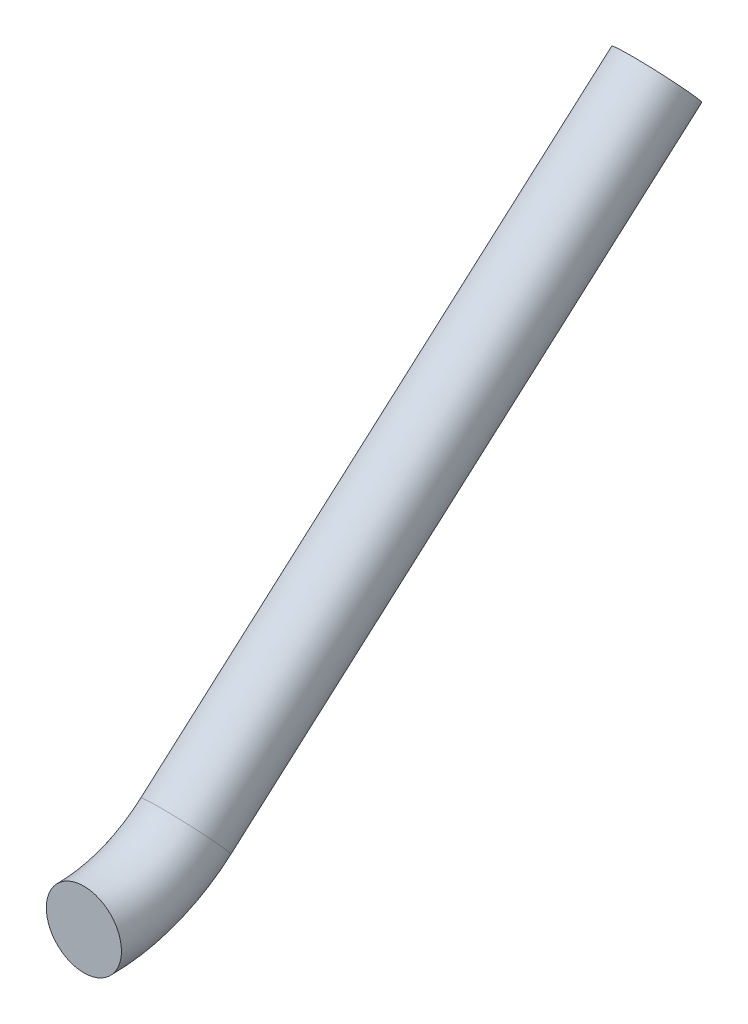
ISO-10303-21;
HEADER;
FILE_DESCRIPTION(('STEP AP214'),'2;1');
FILE_NAME('part.step','',(''),(''),'','','');
FILE_SCHEMA(('AUTOMOTIVE_DESIGN { 1 0 10303 214 1 1 1 1 }'));
ENDSEC;
DATA;
#1=APPLICATION_CONTEXT('core data for automotive mechanical design processes');
#2=APPLICATION_PROTOCOL_DEFINITION('international standard','automotive_design',2000,#1);
#3=PRODUCT_CONTEXT('',#1,'mechanical');
#4=PRODUCT('Part','Part','',(#3));
#5=PRODUCT_RELATED_PRODUCT_CATEGORY('part','',(#4));
#6=PRODUCT_DEFINITION_FORMATION('','',#4);
#7=PRODUCT_DEFINITION_CONTEXT('part definition',#1,'design');
#8=PRODUCT_DEFINITION('design','',#6,#7);
#9=PRODUCT_DEFINITION_SHAPE('','',#8);
#10=(LENGTH_UNIT() NAMED_UNIT(*) SI_UNIT(.MILLI.,.METRE.));
#11=(NAMED_UNIT(*) PLANE_ANGLE_UNIT() SI_UNIT($,.RADIAN.));
#12=(NAMED_UNIT(*) SI_UNIT($,.STERADIAN.) SOLID_ANGLE_UNIT());
#13=UNCERTAINTY_MEASURE_WITH_UNIT(LENGTH_MEASURE(1.E-05),#10,'distance_accuracy_value','');
#14=(GEOMETRIC_REPRESENTATION_CONTEXT(3) GLOBAL_UNCERTAINTY_ASSIGNED_CONTEXT((#13)) GLOBAL_UNIT_ASSIGNED_CONTEXT((#10,
#11,#12)) REPRESENTATION_CONTEXT('',''));
#15=CARTESIAN_POINT('',(0.,0.,0.));
#16=DIRECTION('',(0.,0.,1.));
#17=DIRECTION('',(1.,0.,0.));
#18=AXIS2_PLACEMENT_3D('',#15,#16,#17);
#19=CARTESIAN_POINT('',(0.,-685.140671350022,1306.91949827083));
#20=DIRECTION('',(-1.,0.,0.));
#21=DIRECTION('',(0.,0.,1.));
#22=AXIS2_PLACEMENT_3D('',#19,#20,#21);
#23=TOROIDAL_SURFACE('',#22,351.227249907528,85.725);
#24=CARTESIAN_POINT('',(0.,-948.45787353344,1074.48750367478));
#25=DIRECTION('',(0.,0.661770960702079,-0.749706072785494));
#26=DIRECTION('',(0.,0.749706072785494,0.661770960702079));
#27=AXIS2_PLACEMENT_3D('',#24,#25,#26);
#28=CIRCLE('',#27,85.725);
#29=CARTESIAN_POINT('',(0.,-1012.72642662298,1017.75718806859));
#30=VERTEX_POINT('',#29);
#31=EDGE_CURVE('E34',#30,#30,#28,.T.);
#32=CARTESIAN_POINT('',(0.,-1036.36792125755,1306.91949827083));
#33=DIRECTION('',(0.,0.,-1.));
#34=DIRECTION('',(0.,1.,0.));
#35=AXIS2_PLACEMENT_3D('',#32,#33,#34);
#36=CIRCLE('',#35,85.725);
#37=CARTESIAN_POINT('',(0.,-1122.09292125755,1306.91949827083));
#38=VERTEX_POINT('',#37);
#39=EDGE_CURVE('E10',#38,#38,#36,.T.);
#40=CARTESIAN_POINT('',(0.,-685.140671350022,1306.91949827083));
#41=DIRECTION('',(-1.,0.,0.));
#42=DIRECTION('',(0.,0.,1.));
#43=AXIS2_PLACEMENT_3D('',#40,#41,#42);
#44=CIRCLE('',#43,436.952249907528);
#45=EDGE_CURVE('',#30,#38,#44,.T.);
#46=ORIENTED_EDGE('',*,*,#31,.F.);
#47=ORIENTED_EDGE('',*,*,#39,.T.);
#48=ORIENTED_EDGE('',*,*,#45,.T.);
#49=ORIENTED_EDGE('',*,*,#45,.F.);
#50=EDGE_LOOP('',(#46,#48,#47,#49));
#51=FACE_BOUND('',#50,.T.);
#52=ADVANCED_FACE('F28',(#51),#23,.T.);
#53=CARTESIAN_POINT('',(0.,-948.45787353344,1074.48750367478));
#54=DIRECTION('',(0.,0.661770960702079,-0.749706072785494));
#55=DIRECTION('',(0.,0.749706072785494,0.661770960702079));
#56=AXIS2_PLACEMENT_3D('',#53,#54,#55);
#57=CYLINDRICAL_SURFACE('',#56,85.725);
#58=ORIENTED_EDGE('',*,*,#31,.T.);
#59=EDGE_LOOP('',(#58));
#60=FACE_BOUND('',#59,.T.);
#61=CARTESIAN_POINT('',(0.,0.,0.));
#62=DIRECTION('',(0.,0.661770960702079,-0.749706072785494));
#63=DIRECTION('',(0.,0.749706072785494,0.661770960702079));
#64=AXIS2_PLACEMENT_3D('',#61,#62,#63);
#65=CIRCLE('',#64,85.725);
#66=CARTESIAN_POINT('',(0.,64.2685530895364,56.7303156061857));
#67=VERTEX_POINT('',#66);
#68=EDGE_CURVE('E38',#67,#67,#65,.T.);
#69=ORIENTED_EDGE('',*,*,#68,.F.);
#70=EDGE_LOOP('',(#69));
#71=FACE_BOUND('',#70,.T.);
#72=ADVANCED_FACE('F47',(#60,#71),#57,.T.);
#73=CARTESIAN_POINT('',(0.,-1036.36792125755,1306.91949827083));
#74=DIRECTION('',(0.,0.,-1.));
#75=DIRECTION('',(0.,1.,0.));
#76=AXIS2_PLACEMENT_3D('',#73,#74,#75);
#77=PLANE('',#76);
#78=ORIENTED_EDGE('',*,*,#39,.F.);
#79=EDGE_LOOP('',(#78));
#80=FACE_BOUND('',#79,.T.);
#81=ADVANCED_FACE('F49',(#80),#77,.F.);
#82=CARTESIAN_POINT('',(0.,0.,0.));
#83=DIRECTION('',(0.,0.661770960702079,-0.749706072785494));
#84=DIRECTION('',(0.,0.749706072785494,0.661770960702079));
#85=AXIS2_PLACEMENT_3D('',#82,#83,#84);
#86=PLANE('',#85);
#87=ORIENTED_EDGE('',*,*,#68,.T.);
#88=EDGE_LOOP('',(#87));
#89=FACE_BOUND('',#88,.T.);
#90=ADVANCED_FACE('F45',(#89),#86,.T.);
#91=CLOSED_SHELL('',(#52,#72,#81,#90));
#92=MANIFOLD_SOLID_BREP('B2',#91);
#93=ADVANCED_BREP_SHAPE_REPRESENTATION('',(#18,#92),#14);
#94=SHAPE_DEFINITION_REPRESENTATION(#9,#93);
ENDSEC;
END-ISO-10303-21;
